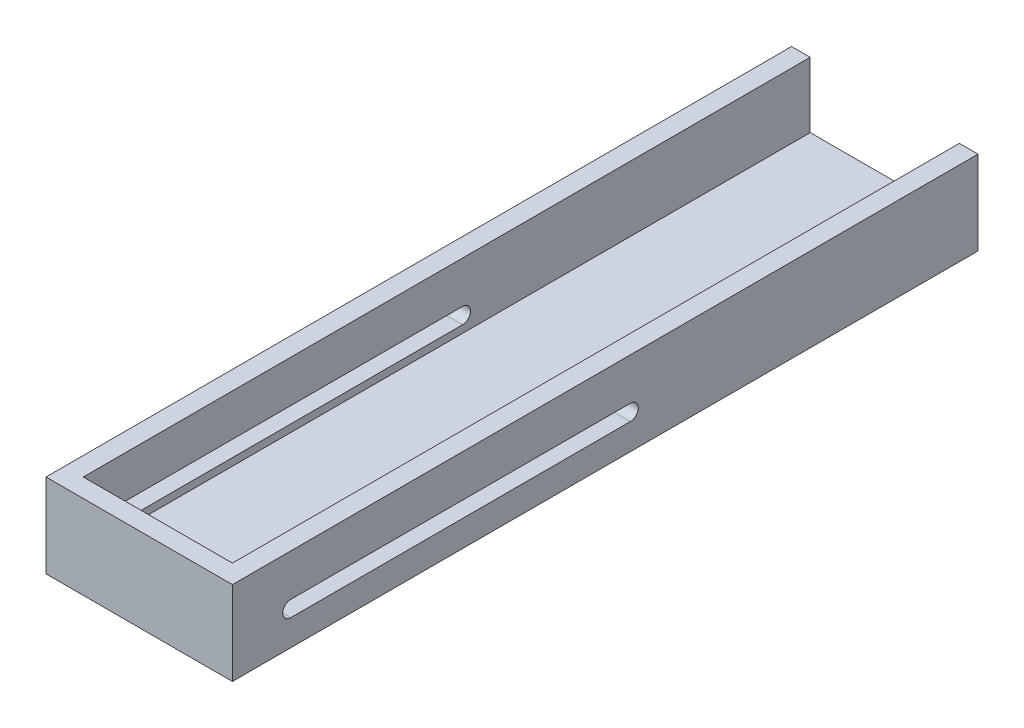
ISO-10303-21;
HEADER;
FILE_DESCRIPTION(('STEP AP214'),'2;1');
FILE_NAME('part.step','',(''),(''),'','','');
FILE_SCHEMA(('AUTOMOTIVE_DESIGN { 1 0 10303 214 1 1 1 1 }'));
ENDSEC;
DATA;
#1=APPLICATION_CONTEXT('core data for automotive mechanical design processes');
#2=APPLICATION_PROTOCOL_DEFINITION('international standard','automotive_design',2000,#1);
#3=PRODUCT_CONTEXT('',#1,'mechanical');
#4=PRODUCT('Part','Part','',(#3));
#5=PRODUCT_RELATED_PRODUCT_CATEGORY('part','',(#4));
#6=PRODUCT_DEFINITION_FORMATION('','',#4);
#7=PRODUCT_DEFINITION_CONTEXT('part definition',#1,'design');
#8=PRODUCT_DEFINITION('design','',#6,#7);
#9=PRODUCT_DEFINITION_SHAPE('','',#8);
#10=(LENGTH_UNIT() NAMED_UNIT(*) SI_UNIT(.MILLI.,.METRE.));
#11=(NAMED_UNIT(*) PLANE_ANGLE_UNIT() SI_UNIT($,.RADIAN.));
#12=(NAMED_UNIT(*) SI_UNIT($,.STERADIAN.) SOLID_ANGLE_UNIT());
#13=UNCERTAINTY_MEASURE_WITH_UNIT(LENGTH_MEASURE(1.E-05),#10,'distance_accuracy_value','');
#14=(GEOMETRIC_REPRESENTATION_CONTEXT(3) GLOBAL_UNCERTAINTY_ASSIGNED_CONTEXT((#13)) GLOBAL_UNIT_ASSIGNED_CONTEXT((#10,
#11,#12)) REPRESENTATION_CONTEXT('',''));
#15=CARTESIAN_POINT('',(0.,0.,0.));
#16=DIRECTION('',(0.,0.,1.));
#17=DIRECTION('',(1.,0.,0.));
#18=AXIS2_PLACEMENT_3D('',#15,#16,#17);
#19=CARTESIAN_POINT('',(25.,6.625,84.3750000000004));
#20=DIRECTION('',(-1.,0.,0.));
#21=DIRECTION('',(0.,0.,1.));
#22=AXIS2_PLACEMENT_3D('',#19,#20,#21);
#23=CYLINDRICAL_SURFACE('',#22,2.125);
#24=DIRECTION('',(-1.,0.,0.));
#25=VECTOR('',#24,1.);
#26=CARTESIAN_POINT('',(25.,4.49999999999999,84.3750000000004));
#27=LINE('',#26,#25);
#28=CARTESIAN_POINT('',(25.,4.49999999999999,84.3750000000004));
#29=VERTEX_POINT('',#28);
#30=CARTESIAN_POINT('',(20.,4.49999999999998,84.3750000000004));
#31=VERTEX_POINT('',#30);
#32=EDGE_CURVE('E170',#29,#31,#27,.T.);
#33=ORIENTED_EDGE('',*,*,#32,.T.);
#34=CARTESIAN_POINT('',(20.,6.625,84.3750000000004));
#35=DIRECTION('',(-1.,0.,0.));
#36=DIRECTION('',(0.,0.,1.));
#37=AXIS2_PLACEMENT_3D('',#34,#35,#36);
#38=CIRCLE('',#37,2.125);
#39=CARTESIAN_POINT('',(20.,8.75,84.3750000000004));
#40=VERTEX_POINT('',#39);
#41=EDGE_CURVE('E11',#31,#40,#38,.T.);
#42=ORIENTED_EDGE('',*,*,#41,.T.);
#43=DIRECTION('',(-1.,0.,0.));
#44=VECTOR('',#43,1.);
#45=CARTESIAN_POINT('',(25.,8.75,84.3750000000004));
#46=LINE('',#45,#44);
#47=CARTESIAN_POINT('',(25.,8.75,84.3750000000004));
#48=VERTEX_POINT('',#47);
#49=EDGE_CURVE('E169',#48,#40,#46,.T.);
#50=ORIENTED_EDGE('',*,*,#49,.F.);
#51=CARTESIAN_POINT('',(25.,6.625,84.3750000000004));
#52=DIRECTION('',(1.,0.,0.));
#53=DIRECTION('',(0.,0.,1.));
#54=AXIS2_PLACEMENT_3D('',#51,#52,#53);
#55=CIRCLE('',#54,2.125);
#56=EDGE_CURVE('E277',#48,#29,#55,.T.);
#57=ORIENTED_EDGE('',*,*,#56,.T.);
#58=EDGE_LOOP('',(#33,#42,#50,#57));
#59=FACE_BOUND('',#58,.T.);
#60=ADVANCED_FACE('F37',(#59),#23,.F.);
#61=CARTESIAN_POINT('',(-20.,8.75,84.3750000000004));
#62=VERTEX_POINT('',#61);
#63=CARTESIAN_POINT('',(-25.,8.75,84.3750000000004));
#64=VERTEX_POINT('',#63);
#65=EDGE_CURVE('E158',#62,#64,#46,.T.);
#66=ORIENTED_EDGE('',*,*,#65,.F.);
#67=CARTESIAN_POINT('',(-20.,6.625,84.3750000000004));
#68=DIRECTION('',(1.,0.,0.));
#69=DIRECTION('',(0.,0.,-1.));
#70=AXIS2_PLACEMENT_3D('',#67,#68,#69);
#71=CIRCLE('',#70,2.125);
#72=CARTESIAN_POINT('',(-20.,4.49999999999999,84.3750000000004));
#73=VERTEX_POINT('',#72);
#74=EDGE_CURVE('E45',#62,#73,#71,.T.);
#75=ORIENTED_EDGE('',*,*,#74,.T.);
#76=CARTESIAN_POINT('',(-25.,4.49999999999999,84.3750000000004));
#77=VERTEX_POINT('',#76);
#78=EDGE_CURVE('E175',#73,#77,#27,.T.);
#79=ORIENTED_EDGE('',*,*,#78,.T.);
#80=CARTESIAN_POINT('',(-25.,6.625,84.3750000000004));
#81=DIRECTION('',(1.,0.,0.));
#82=DIRECTION('',(0.,0.,1.));
#83=AXIS2_PLACEMENT_3D('',#80,#81,#82);
#84=CIRCLE('',#83,2.125);
#85=EDGE_CURVE('E168',#64,#77,#84,.T.);
#86=ORIENTED_EDGE('',*,*,#85,.F.);
#87=EDGE_LOOP('',(#66,#75,#79,#86));
#88=FACE_BOUND('',#87,.T.);
#89=ADVANCED_FACE('F166',(#88),#23,.F.);
#90=CARTESIAN_POINT('',(175.,8.75,90.7500000000004));
#91=DIRECTION('',(0.,1.,0.));
#92=DIRECTION('',(0.,0.,1.));
#93=AXIS2_PLACEMENT_3D('',#90,#91,#92);
#94=PLANE('',#93);
#95=ORIENTED_EDGE('',*,*,#49,.T.);
#96=DIRECTION('',(0.,0.,1.));
#97=VECTOR('',#96,1.);
#98=CARTESIAN_POINT('',(20.,8.75,90.0000000000004));
#99=LINE('',#98,#97);
#100=CARTESIAN_POINT('',(20.,8.75,-6.74999999999966));
#101=VERTEX_POINT('',#100);
#102=EDGE_CURVE('E259',#101,#40,#99,.T.);
#103=ORIENTED_EDGE('',*,*,#102,.F.);
#104=DIRECTION('',(-1.,0.,0.));
#105=VECTOR('',#104,1.);
#106=CARTESIAN_POINT('',(79.,8.75,-6.74999999999966));
#107=LINE('',#106,#105);
#108=CARTESIAN_POINT('',(25.,8.75,-6.74999999999966));
#109=VERTEX_POINT('',#108);
#110=EDGE_CURVE('E184',#109,#101,#107,.T.);
#111=ORIENTED_EDGE('',*,*,#110,.F.);
#112=DIRECTION('',(0.,0.,-1.));
#113=VECTOR('',#112,1.);
#114=CARTESIAN_POINT('',(25.,8.75,99.9999999999996));
#115=LINE('',#114,#113);
#116=EDGE_CURVE('E162',#48,#109,#115,.T.);
#117=ORIENTED_EDGE('',*,*,#116,.F.);
#118=EDGE_LOOP('',(#95,#103,#111,#117));
#119=FACE_BOUND('',#118,.T.);
#120=ADVANCED_FACE('F281',(#119),#94,.F.);
#121=ORIENTED_EDGE('',*,*,#65,.T.);
#122=DIRECTION('',(0.,0.,-1.));
#123=VECTOR('',#122,1.);
#124=CARTESIAN_POINT('',(-25.,8.75,90.7500000000004));
#125=LINE('',#124,#123);
#126=CARTESIAN_POINT('',(-25.,8.75,-6.74999999999966));
#127=VERTEX_POINT('',#126);
#128=EDGE_CURVE('E193',#64,#127,#125,.T.);
#129=ORIENTED_EDGE('',*,*,#128,.T.);
#130=CARTESIAN_POINT('',(-20.,8.75,-6.74999999999966));
#131=VERTEX_POINT('',#130);
#132=EDGE_CURVE('E161',#131,#127,#107,.T.);
#133=ORIENTED_EDGE('',*,*,#132,.F.);
#134=DIRECTION('',(0.,0.,-1.));
#135=VECTOR('',#134,1.);
#136=CARTESIAN_POINT('',(-20.,8.75,90.0000000000004));
#137=LINE('',#136,#135);
#138=EDGE_CURVE('E150',#62,#131,#137,.T.);
#139=ORIENTED_EDGE('',*,*,#138,.F.);
#140=EDGE_LOOP('',(#121,#129,#133,#139));
#141=FACE_BOUND('',#140,.T.);
#142=ADVANCED_FACE('F157',(#141),#94,.F.);
#143=CARTESIAN_POINT('',(175.,4.49999999999999,90.7500000000004));
#144=DIRECTION('',(0.,-1.,0.));
#145=DIRECTION('',(0.,0.,-1.));
#146=AXIS2_PLACEMENT_3D('',#143,#144,#145);
#147=PLANE('',#146);
#148=DIRECTION('',(0.,0.,-1.));
#149=VECTOR('',#148,1.);
#150=CARTESIAN_POINT('',(20.,4.49999999999999,90.0000000000004));
#151=LINE('',#150,#149);
#152=CARTESIAN_POINT('',(20.,4.49999999999998,-6.74999999999966));
#153=VERTEX_POINT('',#152);
#154=EDGE_CURVE('E257',#31,#153,#151,.T.);
#155=ORIENTED_EDGE('',*,*,#154,.F.);
#156=ORIENTED_EDGE('',*,*,#32,.F.);
#157=DIRECTION('',(0.,0.,1.));
#158=VECTOR('',#157,1.);
#159=CARTESIAN_POINT('',(25.,4.49999999999999,99.9999999999996));
#160=LINE('',#159,#158);
#161=CARTESIAN_POINT('',(25.,4.49999999999998,-6.74999999999966));
#162=VERTEX_POINT('',#161);
#163=EDGE_CURVE('E163',#162,#29,#160,.T.);
#164=ORIENTED_EDGE('',*,*,#163,.F.);
#165=DIRECTION('',(-1.,0.,0.));
#166=VECTOR('',#165,1.);
#167=CARTESIAN_POINT('',(79.,4.49999999999998,-6.74999999999966));
#168=LINE('',#167,#166);
#169=EDGE_CURVE('E185',#162,#153,#168,.T.);
#170=ORIENTED_EDGE('',*,*,#169,.T.);
#171=EDGE_LOOP('',(#155,#156,#164,#170));
#172=FACE_BOUND('',#171,.T.);
#173=ADVANCED_FACE('F274',(#172),#147,.F.);
#174=DIRECTION('',(0.,0.,1.));
#175=VECTOR('',#174,1.);
#176=CARTESIAN_POINT('',(-25.,4.49999999999999,90.7500000000004));
#177=LINE('',#176,#175);
#178=CARTESIAN_POINT('',(-25.,4.49999999999998,-6.74999999999966));
#179=VERTEX_POINT('',#178);
#180=EDGE_CURVE('E52',#179,#77,#177,.T.);
#181=ORIENTED_EDGE('',*,*,#180,.T.);
#182=ORIENTED_EDGE('',*,*,#78,.F.);
#183=DIRECTION('',(0.,0.,1.));
#184=VECTOR('',#183,1.);
#185=CARTESIAN_POINT('',(-20.,4.49999999999999,90.0000000000004));
#186=LINE('',#185,#184);
#187=CARTESIAN_POINT('',(-20.,4.49999999999998,-6.74999999999966));
#188=VERTEX_POINT('',#187);
#189=EDGE_CURVE('E60',#188,#73,#186,.T.);
#190=ORIENTED_EDGE('',*,*,#189,.F.);
#191=EDGE_CURVE('E182',#188,#179,#168,.T.);
#192=ORIENTED_EDGE('',*,*,#191,.T.);
#193=EDGE_LOOP('',(#181,#182,#190,#192));
#194=FACE_BOUND('',#193,.T.);
#195=ADVANCED_FACE('F290',(#194),#147,.F.);
#196=CARTESIAN_POINT('',(25.,20.,99.9999999999996));
#197=DIRECTION('',(-1.,0.,0.));
#198=DIRECTION('',(0.,0.,1.));
#199=AXIS2_PLACEMENT_3D('',#196,#197,#198);
#200=PLANE('',#199);
#201=DIRECTION('',(0.,0.,-1.));
#202=VECTOR('',#201,1.);
#203=CARTESIAN_POINT('',(25.,-2.5,100.));
#204=LINE('',#203,#202);
#205=CARTESIAN_POINT('',(25.,-2.5,100.));
#206=VERTEX_POINT('',#205);
#207=CARTESIAN_POINT('',(25.,-2.5,-99.9999999999996));
#208=VERTEX_POINT('',#207);
#209=EDGE_CURVE('E203',#206,#208,#204,.T.);
#210=ORIENTED_EDGE('',*,*,#209,.T.);
#211=DIRECTION('',(0.,-1.,0.));
#212=VECTOR('',#211,1.);
#213=CARTESIAN_POINT('',(25.,20.,-99.9999999999996));
#214=LINE('',#213,#212);
#215=CARTESIAN_POINT('',(25.,20.,-99.9999999999996));
#216=VERTEX_POINT('',#215);
#217=EDGE_CURVE('E250',#216,#208,#214,.T.);
#218=ORIENTED_EDGE('',*,*,#217,.F.);
#219=DIRECTION('',(0.,0.,-1.));
#220=VECTOR('',#219,1.);
#221=CARTESIAN_POINT('',(25.,20.,99.9999999999996));
#222=LINE('',#221,#220);
#223=CARTESIAN_POINT('',(25.,20.,99.9999999999996));
#224=VERTEX_POINT('',#223);
#225=EDGE_CURVE('E231',#224,#216,#222,.T.);
#226=ORIENTED_EDGE('',*,*,#225,.F.);
#227=DIRECTION('',(0.,-1.,0.));
#228=VECTOR('',#227,1.);
#229=CARTESIAN_POINT('',(25.,20.,99.9999999999996));
#230=LINE('',#229,#228);
#231=EDGE_CURVE('E244',#224,#206,#230,.T.);
#232=ORIENTED_EDGE('',*,*,#231,.T.);
#233=EDGE_LOOP('',(#210,#218,#226,#232));
#234=FACE_BOUND('',#233,.T.);
#235=ORIENTED_EDGE('',*,*,#163,.T.);
#236=ORIENTED_EDGE('',*,*,#56,.F.);
#237=ORIENTED_EDGE('',*,*,#116,.T.);
#238=CARTESIAN_POINT('',(25.,6.62499999999999,-6.74999999999966));
#239=DIRECTION('',(-1.,0.,0.));
#240=DIRECTION('',(0.,0.,1.));
#241=AXIS2_PLACEMENT_3D('',#238,#239,#240);
#242=CIRCLE('',#241,2.12500000000001);
#243=EDGE_CURVE('E189',#109,#162,#242,.T.);
#244=ORIENTED_EDGE('',*,*,#243,.T.);
#245=EDGE_LOOP('',(#235,#236,#237,#244));
#246=FACE_BOUND('',#245,.T.);
#247=ADVANCED_FACE('F39',(#234,#246),#200,.F.);
#248=CARTESIAN_POINT('',(-25.,20.,-99.9999999999996));
#249=DIRECTION('',(0.,0.,1.));
#250=DIRECTION('',(1.,0.,0.));
#251=AXIS2_PLACEMENT_3D('',#248,#249,#250);
#252=PLANE('',#251);
#253=DIRECTION('',(-1.,0.,0.));
#254=VECTOR('',#253,1.);
#255=CARTESIAN_POINT('',(20.,2.49999999999999,-99.9999999999996));
#256=LINE('',#255,#254);
#257=CARTESIAN_POINT('',(20.,2.49999999999999,-99.9999999999996));
#258=VERTEX_POINT('',#257);
#259=CARTESIAN_POINT('',(-20.,2.49999999999999,-99.9999999999996));
#260=VERTEX_POINT('',#259);
#261=EDGE_CURVE('E225',#258,#260,#256,.T.);
#262=ORIENTED_EDGE('',*,*,#261,.F.);
#263=DIRECTION('',(0.,-1.,0.));
#264=VECTOR('',#263,1.);
#265=CARTESIAN_POINT('',(20.,37.5,-99.9999999999996));
#266=LINE('',#265,#264);
#267=CARTESIAN_POINT('',(20.,20.,-99.9999999999996));
#268=VERTEX_POINT('',#267);
#269=EDGE_CURVE('E223',#268,#258,#266,.T.);
#270=ORIENTED_EDGE('',*,*,#269,.F.);
#271=DIRECTION('',(-1.,0.,0.));
#272=VECTOR('',#271,1.);
#273=CARTESIAN_POINT('',(-25.,20.,-99.9999999999996));
#274=LINE('',#273,#272);
#275=EDGE_CURVE('E237',#216,#268,#274,.T.);
#276=ORIENTED_EDGE('',*,*,#275,.F.);
#277=ORIENTED_EDGE('',*,*,#217,.T.);
#278=DIRECTION('',(-1.,0.,0.));
#279=VECTOR('',#278,1.);
#280=CARTESIAN_POINT('',(25.,-2.5,-99.9999999999996));
#281=LINE('',#280,#279);
#282=CARTESIAN_POINT('',(-25.,-2.5,-99.9999999999996));
#283=VERTEX_POINT('',#282);
#284=EDGE_CURVE('E199',#208,#283,#281,.T.);
#285=ORIENTED_EDGE('',*,*,#284,.T.);
#286=DIRECTION('',(0.,-1.,0.));
#287=VECTOR('',#286,1.);
#288=CARTESIAN_POINT('',(-25.,20.,-99.9999999999996));
#289=LINE('',#288,#287);
#290=CARTESIAN_POINT('',(-25.,20.,-99.9999999999996));
#291=VERTEX_POINT('',#290);
#292=EDGE_CURVE('E248',#291,#283,#289,.T.);
#293=ORIENTED_EDGE('',*,*,#292,.F.);
#294=CARTESIAN_POINT('',(-20.,20.,-99.9999999999996));
#295=VERTEX_POINT('',#294);
#296=EDGE_CURVE('E236',#295,#291,#274,.T.);
#297=ORIENTED_EDGE('',*,*,#296,.F.);
#298=DIRECTION('',(0.,1.,0.));
#299=VECTOR('',#298,1.);
#300=CARTESIAN_POINT('',(-20.,37.5,-99.9999999999996));
#301=LINE('',#300,#299);
#302=EDGE_CURVE('E221',#260,#295,#301,.T.);
#303=ORIENTED_EDGE('',*,*,#302,.F.);
#304=EDGE_LOOP('',(#262,#270,#276,#277,#285,#293,#297,#303));
#305=FACE_BOUND('',#304,.T.);
#306=ADVANCED_FACE('F297',(#305),#252,.F.);
#307=CARTESIAN_POINT('',(-25.,20.,99.9999999999996));
#308=DIRECTION('',(1.,0.,0.));
#309=DIRECTION('',(0.,0.,-1.));
#310=AXIS2_PLACEMENT_3D('',#307,#308,#309);
#311=PLANE('',#310);
#312=ORIENTED_EDGE('',*,*,#128,.F.);
#313=ORIENTED_EDGE('',*,*,#85,.T.);
#314=ORIENTED_EDGE('',*,*,#180,.F.);
#315=CARTESIAN_POINT('',(-25.,6.62499999999999,-6.74999999999966));
#316=DIRECTION('',(-1.,0.,0.));
#317=DIRECTION('',(0.,0.,1.));
#318=AXIS2_PLACEMENT_3D('',#315,#316,#317);
#319=CIRCLE('',#318,2.12500000000001);
#320=EDGE_CURVE('E173',#127,#179,#319,.T.);
#321=ORIENTED_EDGE('',*,*,#320,.F.);
#322=EDGE_LOOP('',(#312,#313,#314,#321));
#323=FACE_BOUND('',#322,.T.);
#324=ORIENTED_EDGE('',*,*,#292,.T.);
#325=DIRECTION('',(0.,0.,-1.));
#326=VECTOR('',#325,1.);
#327=CARTESIAN_POINT('',(-25.,-2.5,100.));
#328=LINE('',#327,#326);
#329=CARTESIAN_POINT('',(-25.,-2.5,100.));
#330=VERTEX_POINT('',#329);
#331=EDGE_CURVE('E206',#330,#283,#328,.T.);
#332=ORIENTED_EDGE('',*,*,#331,.F.);
#333=DIRECTION('',(0.,-1.,0.));
#334=VECTOR('',#333,1.);
#335=CARTESIAN_POINT('',(-25.,20.,99.9999999999996));
#336=LINE('',#335,#334);
#337=CARTESIAN_POINT('',(-25.,20.,99.9999999999996));
#338=VERTEX_POINT('',#337);
#339=EDGE_CURVE('E246',#338,#330,#336,.T.);
#340=ORIENTED_EDGE('',*,*,#339,.F.);
#341=DIRECTION('',(0.,0.,1.));
#342=VECTOR('',#341,1.);
#343=CARTESIAN_POINT('',(-25.,20.,99.9999999999996));
#344=LINE('',#343,#342);
#345=EDGE_CURVE('E240',#291,#338,#344,.T.);
#346=ORIENTED_EDGE('',*,*,#345,.F.);
#347=EDGE_LOOP('',(#324,#332,#340,#346));
#348=FACE_BOUND('',#347,.T.);
#349=ADVANCED_FACE('F284',(#323,#348),#311,.F.);
#350=CARTESIAN_POINT('',(-25.,20.,99.9999999999996));
#351=DIRECTION('',(0.,0.,-1.));
#352=DIRECTION('',(-1.,0.,0.));
#353=AXIS2_PLACEMENT_3D('',#350,#351,#352);
#354=PLANE('',#353);
#355=ORIENTED_EDGE('',*,*,#339,.T.);
#356=DIRECTION('',(-1.,0.,0.));
#357=VECTOR('',#356,1.);
#358=CARTESIAN_POINT('',(25.,-2.5,100.));
#359=LINE('',#358,#357);
#360=EDGE_CURVE('E200',#206,#330,#359,.T.);
#361=ORIENTED_EDGE('',*,*,#360,.F.);
#362=ORIENTED_EDGE('',*,*,#231,.F.);
#363=DIRECTION('',(1.,0.,0.));
#364=VECTOR('',#363,1.);
#365=CARTESIAN_POINT('',(-25.,20.,99.9999999999996));
#366=LINE('',#365,#364);
#367=EDGE_CURVE('E242',#338,#224,#366,.T.);
#368=ORIENTED_EDGE('',*,*,#367,.F.);
#369=EDGE_LOOP('',(#355,#361,#362,#368));
#370=FACE_BOUND('',#369,.T.);
#371=ADVANCED_FACE('F385',(#370),#354,.F.);
#372=CARTESIAN_POINT('',(0.,20.,0.));
#373=DIRECTION('',(0.,-1.,0.));
#374=DIRECTION('',(0.,0.,-1.));
#375=AXIS2_PLACEMENT_3D('',#372,#373,#374);
#376=PLANE('',#375);
#377=DIRECTION('',(0.,0.,1.));
#378=VECTOR('',#377,1.);
#379=CARTESIAN_POINT('',(20.,20.,0.));
#380=LINE('',#379,#378);
#381=CARTESIAN_POINT('',(20.,20.,95.0000000000004));
#382=VERTEX_POINT('',#381);
#383=EDGE_CURVE('E252',#268,#382,#380,.T.);
#384=ORIENTED_EDGE('',*,*,#383,.T.);
#385=DIRECTION('',(1.,0.,0.));
#386=VECTOR('',#385,1.);
#387=CARTESIAN_POINT('',(20.,20.,95.0000000000004));
#388=LINE('',#387,#386);
#389=CARTESIAN_POINT('',(-20.,20.,95.0000000000004));
#390=VERTEX_POINT('',#389);
#391=EDGE_CURVE('E218',#390,#382,#388,.T.);
#392=ORIENTED_EDGE('',*,*,#391,.F.);
#393=DIRECTION('',(0.,0.,-1.));
#394=VECTOR('',#393,1.);
#395=CARTESIAN_POINT('',(-20.,20.,0.));
#396=LINE('',#395,#394);
#397=EDGE_CURVE('E254',#390,#295,#396,.T.);
#398=ORIENTED_EDGE('',*,*,#397,.T.);
#399=ORIENTED_EDGE('',*,*,#296,.T.);
#400=ORIENTED_EDGE('',*,*,#345,.T.);
#401=ORIENTED_EDGE('',*,*,#367,.T.);
#402=ORIENTED_EDGE('',*,*,#225,.T.);
#403=ORIENTED_EDGE('',*,*,#275,.T.);
#404=EDGE_LOOP('',(#384,#392,#398,#399,#400,#401,#402,#403));
#405=FACE_BOUND('',#404,.T.);
#406=ADVANCED_FACE('F336',(#405),#376,.F.);
#407=CARTESIAN_POINT('',(-20.,37.5,90.0000000000004));
#408=DIRECTION('',(-1.,0.,0.));
#409=DIRECTION('',(0.,-1.,0.));
#410=AXIS2_PLACEMENT_3D('',#407,#408,#409);
#411=PLANE('',#410);
#412=ORIENTED_EDGE('',*,*,#397,.F.);
#413=DIRECTION('',(0.,1.,0.));
#414=VECTOR('',#413,1.);
#415=CARTESIAN_POINT('',(-20.,2.49999999999999,95.0000000000004));
#416=LINE('',#415,#414);
#417=CARTESIAN_POINT('',(-20.,2.49999999999999,95.0000000000004));
#418=VERTEX_POINT('',#417);
#419=EDGE_CURVE('E216',#418,#390,#416,.T.);
#420=ORIENTED_EDGE('',*,*,#419,.F.);
#421=DIRECTION('',(0.,0.,-1.));
#422=VECTOR('',#421,1.);
#423=CARTESIAN_POINT('',(-20.,2.49999999999999,90.0000000000004));
#424=LINE('',#423,#422);
#425=EDGE_CURVE('E229',#418,#260,#424,.T.);
#426=ORIENTED_EDGE('',*,*,#425,.T.);
#427=ORIENTED_EDGE('',*,*,#302,.T.);
#428=EDGE_LOOP('',(#412,#420,#426,#427));
#429=FACE_BOUND('',#428,.T.);
#430=ORIENTED_EDGE('',*,*,#74,.F.);
#431=ORIENTED_EDGE('',*,*,#138,.T.);
#432=CARTESIAN_POINT('',(-20.,6.62499999999999,-6.74999999999966));
#433=DIRECTION('',(-1.,0.,0.));
#434=DIRECTION('',(0.,-1.,0.));
#435=AXIS2_PLACEMENT_3D('',#432,#433,#434);
#436=CIRCLE('',#435,2.12500000000001);
#437=EDGE_CURVE('E187',#131,#188,#436,.T.);
#438=ORIENTED_EDGE('',*,*,#437,.T.);
#439=ORIENTED_EDGE('',*,*,#189,.T.);
#440=EDGE_LOOP('',(#430,#431,#438,#439));
#441=FACE_BOUND('',#440,.T.);
#442=ADVANCED_FACE('F149',(#429,#441),#411,.F.);
#443=CARTESIAN_POINT('',(20.,37.5,90.0000000000004));
#444=DIRECTION('',(1.,0.,0.));
#445=DIRECTION('',(0.,1.,0.));
#446=AXIS2_PLACEMENT_3D('',#443,#444,#445);
#447=PLANE('',#446);
#448=DIRECTION('',(0.,0.,-1.));
#449=VECTOR('',#448,1.);
#450=CARTESIAN_POINT('',(20.,2.49999999999999,90.0000000000004));
#451=LINE('',#450,#449);
#452=CARTESIAN_POINT('',(20.,2.49999999999999,95.0000000000004));
#453=VERTEX_POINT('',#452);
#454=EDGE_CURVE('E228',#453,#258,#451,.T.);
#455=ORIENTED_EDGE('',*,*,#454,.F.);
#456=DIRECTION('',(0.,-1.,0.));
#457=VECTOR('',#456,1.);
#458=CARTESIAN_POINT('',(20.,2.49999999999999,95.0000000000004));
#459=LINE('',#458,#457);
#460=EDGE_CURVE('E209',#382,#453,#459,.T.);
#461=ORIENTED_EDGE('',*,*,#460,.F.);
#462=ORIENTED_EDGE('',*,*,#383,.F.);
#463=ORIENTED_EDGE('',*,*,#269,.T.);
#464=EDGE_LOOP('',(#455,#461,#462,#463));
#465=FACE_BOUND('',#464,.T.);
#466=ORIENTED_EDGE('',*,*,#102,.T.);
#467=ORIENTED_EDGE('',*,*,#41,.F.);
#468=ORIENTED_EDGE('',*,*,#154,.T.);
#469=CARTESIAN_POINT('',(20.,6.62499999999999,-6.74999999999966));
#470=DIRECTION('',(1.,0.,0.));
#471=DIRECTION('',(0.,1.,0.));
#472=AXIS2_PLACEMENT_3D('',#469,#470,#471);
#473=CIRCLE('',#472,2.12500000000001);
#474=EDGE_CURVE('E154',#153,#101,#473,.T.);
#475=ORIENTED_EDGE('',*,*,#474,.T.);
#476=EDGE_LOOP('',(#466,#467,#468,#475));
#477=FACE_BOUND('',#476,.T.);
#478=ADVANCED_FACE('F264',(#465,#477),#447,.F.);
#479=CARTESIAN_POINT('',(20.,2.49999999999999,90.0000000000004));
#480=DIRECTION('',(0.,-1.,0.));
#481=DIRECTION('',(0.,0.,-1.));
#482=AXIS2_PLACEMENT_3D('',#479,#480,#481);
#483=PLANE('',#482);
#484=ORIENTED_EDGE('',*,*,#261,.T.);
#485=ORIENTED_EDGE('',*,*,#425,.F.);
#486=DIRECTION('',(-1.,0.,0.));
#487=VECTOR('',#486,1.);
#488=CARTESIAN_POINT('',(20.,2.49999999999999,95.0000000000004));
#489=LINE('',#488,#487);
#490=EDGE_CURVE('E213',#453,#418,#489,.T.);
#491=ORIENTED_EDGE('',*,*,#490,.F.);
#492=ORIENTED_EDGE('',*,*,#454,.T.);
#493=EDGE_LOOP('',(#484,#485,#491,#492));
#494=FACE_BOUND('',#493,.T.);
#495=ADVANCED_FACE('F349',(#494),#483,.F.);
#496=CARTESIAN_POINT('',(0.,0.,95.0000000000004));
#497=DIRECTION('',(0.,0.,1.));
#498=DIRECTION('',(1.,0.,0.));
#499=AXIS2_PLACEMENT_3D('',#496,#497,#498);
#500=PLANE('',#499);
#501=ORIENTED_EDGE('',*,*,#460,.T.);
#502=ORIENTED_EDGE('',*,*,#490,.T.);
#503=ORIENTED_EDGE('',*,*,#419,.T.);
#504=ORIENTED_EDGE('',*,*,#391,.T.);
#505=EDGE_LOOP('',(#501,#502,#503,#504));
#506=FACE_BOUND('',#505,.T.);
#507=ADVANCED_FACE('F356',(#506),#500,.F.);
#508=CARTESIAN_POINT('',(25.,-2.5,100.));
#509=DIRECTION('',(0.,-1.,0.));
#510=DIRECTION('',(0.,0.,-1.));
#511=AXIS2_PLACEMENT_3D('',#508,#509,#510);
#512=PLANE('',#511);
#513=ORIENTED_EDGE('',*,*,#284,.F.);
#514=ORIENTED_EDGE('',*,*,#209,.F.);
#515=ORIENTED_EDGE('',*,*,#360,.T.);
#516=ORIENTED_EDGE('',*,*,#331,.T.);
#517=EDGE_LOOP('',(#513,#514,#515,#516));
#518=FACE_BOUND('',#517,.T.);
#519=ADVANCED_FACE('F359',(#518),#512,.T.);
#520=CARTESIAN_POINT('',(79.,6.62499999999999,-6.74999999999966));
#521=DIRECTION('',(-1.,0.,0.));
#522=DIRECTION('',(0.,0.,1.));
#523=AXIS2_PLACEMENT_3D('',#520,#521,#522);
#524=CYLINDRICAL_SURFACE('',#523,2.12500000000001);
#525=ORIENTED_EDGE('',*,*,#132,.T.);
#526=ORIENTED_EDGE('',*,*,#320,.T.);
#527=ORIENTED_EDGE('',*,*,#191,.F.);
#528=ORIENTED_EDGE('',*,*,#437,.F.);
#529=EDGE_LOOP('',(#525,#526,#527,#528));
#530=FACE_BOUND('',#529,.T.);
#531=ADVANCED_FACE('F288',(#530),#524,.F.);
#532=ORIENTED_EDGE('',*,*,#110,.T.);
#533=ORIENTED_EDGE('',*,*,#474,.F.);
#534=ORIENTED_EDGE('',*,*,#169,.F.);
#535=ORIENTED_EDGE('',*,*,#243,.F.);
#536=EDGE_LOOP('',(#532,#533,#534,#535));
#537=FACE_BOUND('',#536,.T.);
#538=ADVANCED_FACE('F270',(#537),#524,.F.);
#539=CLOSED_SHELL('',(#60,#89,#120,#142,#173,#195,#247,#306,#349,#371,#406,#442,#478,#495,#507,
#519,#531,#538));
#540=MANIFOLD_SOLID_BREP('B2',#539);
#541=ADVANCED_BREP_SHAPE_REPRESENTATION('',(#18,#540),#14);
#542=SHAPE_DEFINITION_REPRESENTATION(#9,#541);
ENDSEC;
END-ISO-10303-21;
